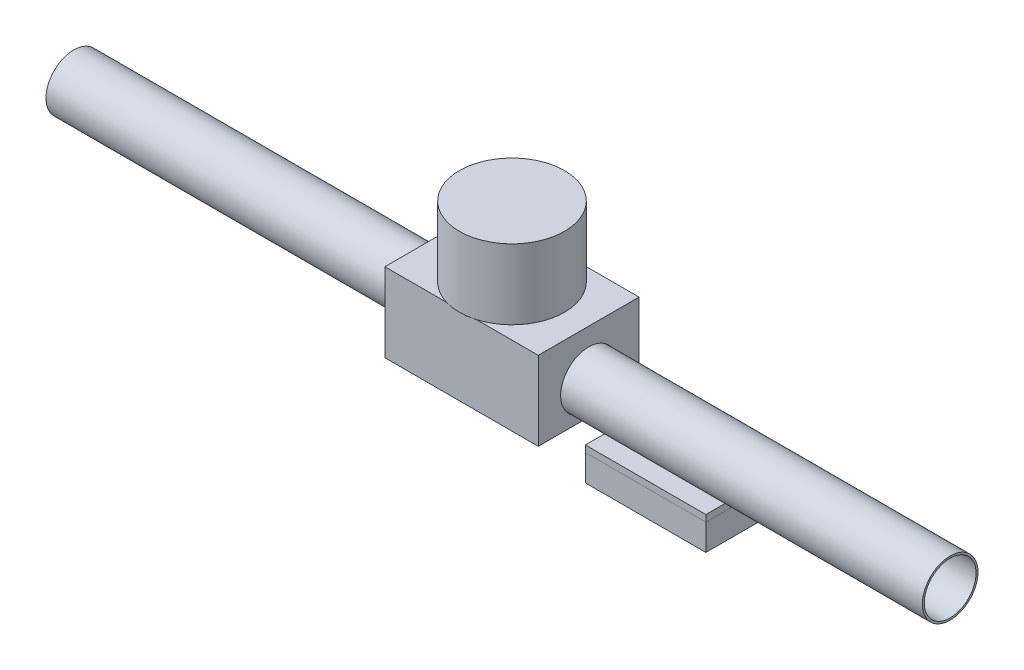
ISO-10303-21;
HEADER;
FILE_DESCRIPTION(('STEP AP214'),'2;1');
FILE_NAME('part.step','',(''),(''),'','','');
FILE_SCHEMA(('AUTOMOTIVE_DESIGN { 1 0 10303 214 1 1 1 1 }'));
ENDSEC;
DATA;
#1=APPLICATION_CONTEXT('core data for automotive mechanical design processes');
#2=APPLICATION_PROTOCOL_DEFINITION('international standard','automotive_design',2000,#1);
#3=PRODUCT_CONTEXT('',#1,'mechanical');
#4=PRODUCT('Part','Part','',(#3));
#5=PRODUCT_RELATED_PRODUCT_CATEGORY('part','',(#4));
#6=PRODUCT_DEFINITION_FORMATION('','',#4);
#7=PRODUCT_DEFINITION_CONTEXT('part definition',#1,'design');
#8=PRODUCT_DEFINITION('design','',#6,#7);
#9=PRODUCT_DEFINITION_SHAPE('','',#8);
#10=(LENGTH_UNIT() NAMED_UNIT(*) SI_UNIT(.MILLI.,.METRE.));
#11=(NAMED_UNIT(*) PLANE_ANGLE_UNIT() SI_UNIT($,.RADIAN.));
#12=(NAMED_UNIT(*) SI_UNIT($,.STERADIAN.) SOLID_ANGLE_UNIT());
#13=UNCERTAINTY_MEASURE_WITH_UNIT(LENGTH_MEASURE(1.E-05),#10,'distance_accuracy_value','');
#14=(GEOMETRIC_REPRESENTATION_CONTEXT(3) GLOBAL_UNCERTAINTY_ASSIGNED_CONTEXT((#13)) GLOBAL_UNIT_ASSIGNED_CONTEXT((#10,
#11,#12)) REPRESENTATION_CONTEXT('',''));
#15=CARTESIAN_POINT('',(0.,0.,0.));
#16=DIRECTION('',(0.,0.,1.));
#17=DIRECTION('',(1.,0.,0.));
#18=AXIS2_PLACEMENT_3D('',#15,#16,#17);
#19=CARTESIAN_POINT('',(47.5,-27.7,14.));
#20=DIRECTION('',(-1.,0.,0.));
#21=DIRECTION('',(0.,0.,1.));
#22=AXIS2_PLACEMENT_3D('',#19,#20,#21);
#23=PLANE('',#22);
#24=DIRECTION('',(0.,0.,1.));
#25=VECTOR('',#24,1.);
#26=CARTESIAN_POINT('',(47.5,-15.7,14.));
#27=LINE('',#26,#25);
#28=CARTESIAN_POINT('',(47.5,-15.7,-14.));
#29=VERTEX_POINT('',#28);
#30=CARTESIAN_POINT('',(47.5,-15.7,14.));
#31=VERTEX_POINT('',#30);
#32=EDGE_CURVE('E120',#29,#31,#27,.T.);
#33=ORIENTED_EDGE('',*,*,#32,.F.);
#34=DIRECTION('',(0.,1.,0.));
#35=VECTOR('',#34,1.);
#36=CARTESIAN_POINT('',(47.5,-27.7,-14.));
#37=LINE('',#36,#35);
#38=CARTESIAN_POINT('',(47.5,-27.7,-14.));
#39=VERTEX_POINT('',#38);
#40=EDGE_CURVE('E12',#39,#29,#37,.T.);
#41=ORIENTED_EDGE('',*,*,#40,.F.);
#42=DIRECTION('',(0.,0.,1.));
#43=VECTOR('',#42,1.);
#44=CARTESIAN_POINT('',(47.5,-27.7,14.));
#45=LINE('',#44,#43);
#46=CARTESIAN_POINT('',(47.5,-27.7,14.));
#47=VERTEX_POINT('',#46);
#48=EDGE_CURVE('E114',#39,#47,#45,.T.);
#49=ORIENTED_EDGE('',*,*,#48,.T.);
#50=DIRECTION('',(0.,1.,0.));
#51=VECTOR('',#50,1.);
#52=CARTESIAN_POINT('',(47.5,-27.7,14.));
#53=LINE('',#52,#51);
#54=EDGE_CURVE('E59',#47,#31,#53,.T.);
#55=ORIENTED_EDGE('',*,*,#54,.T.);
#56=EDGE_LOOP('',(#33,#41,#49,#55));
#57=FACE_BOUND('',#56,.T.);
#58=ADVANCED_FACE('F56',(#57),#23,.T.);
#59=CARTESIAN_POINT('',(47.5,-27.7,-14.));
#60=DIRECTION('',(0.,0.,-1.));
#61=DIRECTION('',(-1.,0.,0.));
#62=AXIS2_PLACEMENT_3D('',#59,#60,#61);
#63=PLANE('',#62);
#64=DIRECTION('',(-1.,0.,0.));
#65=VECTOR('',#64,1.);
#66=CARTESIAN_POINT('',(47.5,-15.7,-14.));
#67=LINE('',#66,#65);
#68=CARTESIAN_POINT('',(102.5,-15.7,-14.));
#69=VERTEX_POINT('',#68);
#70=EDGE_CURVE('E116',#69,#29,#67,.T.);
#71=ORIENTED_EDGE('',*,*,#70,.F.);
#72=DIRECTION('',(0.,1.,0.));
#73=VECTOR('',#72,1.);
#74=CARTESIAN_POINT('',(102.5,-27.7,-14.));
#75=LINE('',#74,#73);
#76=CARTESIAN_POINT('',(102.5,-27.7,-14.));
#77=VERTEX_POINT('',#76);
#78=EDGE_CURVE('E65',#77,#69,#75,.T.);
#79=ORIENTED_EDGE('',*,*,#78,.F.);
#80=DIRECTION('',(-1.,0.,0.));
#81=VECTOR('',#80,1.);
#82=CARTESIAN_POINT('',(47.5,-27.7,-14.));
#83=LINE('',#82,#81);
#84=EDGE_CURVE('E111',#77,#39,#83,.T.);
#85=ORIENTED_EDGE('',*,*,#84,.T.);
#86=ORIENTED_EDGE('',*,*,#40,.T.);
#87=EDGE_LOOP('',(#71,#79,#85,#86));
#88=FACE_BOUND('',#87,.T.);
#89=ADVANCED_FACE('F130',(#88),#63,.T.);
#90=CARTESIAN_POINT('',(102.5,-27.7,14.));
#91=DIRECTION('',(1.,0.,0.));
#92=DIRECTION('',(0.,0.,-1.));
#93=AXIS2_PLACEMENT_3D('',#90,#91,#92);
#94=PLANE('',#93);
#95=DIRECTION('',(0.,0.,-1.));
#96=VECTOR('',#95,1.);
#97=CARTESIAN_POINT('',(102.5,-15.7,14.));
#98=LINE('',#97,#96);
#99=CARTESIAN_POINT('',(102.5,-15.7,14.));
#100=VERTEX_POINT('',#99);
#101=EDGE_CURVE('E106',#100,#69,#98,.T.);
#102=ORIENTED_EDGE('',*,*,#101,.F.);
#103=DIRECTION('',(0.,1.,0.));
#104=VECTOR('',#103,1.);
#105=CARTESIAN_POINT('',(102.5,-27.7,14.));
#106=LINE('',#105,#104);
#107=CARTESIAN_POINT('',(102.5,-27.7,14.));
#108=VERTEX_POINT('',#107);
#109=EDGE_CURVE('E101',#108,#100,#106,.T.);
#110=ORIENTED_EDGE('',*,*,#109,.F.);
#111=DIRECTION('',(0.,0.,-1.));
#112=VECTOR('',#111,1.);
#113=CARTESIAN_POINT('',(102.5,-27.7,14.));
#114=LINE('',#113,#112);
#115=EDGE_CURVE('E104',#108,#77,#114,.T.);
#116=ORIENTED_EDGE('',*,*,#115,.T.);
#117=ORIENTED_EDGE('',*,*,#78,.T.);
#118=EDGE_LOOP('',(#102,#110,#116,#117));
#119=FACE_BOUND('',#118,.T.);
#120=ADVANCED_FACE('F103',(#119),#94,.T.);
#121=CARTESIAN_POINT('',(47.5,-27.7,14.));
#122=DIRECTION('',(0.,0.,1.));
#123=DIRECTION('',(1.,0.,0.));
#124=AXIS2_PLACEMENT_3D('',#121,#122,#123);
#125=PLANE('',#124);
#126=DIRECTION('',(1.,0.,0.));
#127=VECTOR('',#126,1.);
#128=CARTESIAN_POINT('',(47.5,-15.7,14.));
#129=LINE('',#128,#127);
#130=EDGE_CURVE('E123',#31,#100,#129,.T.);
#131=ORIENTED_EDGE('',*,*,#130,.F.);
#132=ORIENTED_EDGE('',*,*,#54,.F.);
#133=DIRECTION('',(1.,0.,0.));
#134=VECTOR('',#133,1.);
#135=CARTESIAN_POINT('',(47.5,-27.7,14.));
#136=LINE('',#135,#134);
#137=EDGE_CURVE('E110',#47,#108,#136,.T.);
#138=ORIENTED_EDGE('',*,*,#137,.T.);
#139=ORIENTED_EDGE('',*,*,#109,.T.);
#140=EDGE_LOOP('',(#131,#132,#138,#139));
#141=FACE_BOUND('',#140,.T.);
#142=ADVANCED_FACE('F113',(#141),#125,.T.);
#143=CARTESIAN_POINT('',(0.,-27.7,0.));
#144=DIRECTION('',(0.,-1.,0.));
#145=DIRECTION('',(0.,0.,-1.));
#146=AXIS2_PLACEMENT_3D('',#143,#144,#145);
#147=PLANE('',#146);
#148=ORIENTED_EDGE('',*,*,#48,.F.);
#149=ORIENTED_EDGE('',*,*,#84,.F.);
#150=ORIENTED_EDGE('',*,*,#115,.F.);
#151=ORIENTED_EDGE('',*,*,#137,.F.);
#152=EDGE_LOOP('',(#148,#149,#150,#151));
#153=FACE_BOUND('',#152,.T.);
#154=ADVANCED_FACE('F109',(#153),#147,.T.);
#155=CARTESIAN_POINT('',(0.,-15.7,0.));
#156=DIRECTION('',(0.,-1.,0.));
#157=DIRECTION('',(0.,0.,-1.));
#158=AXIS2_PLACEMENT_3D('',#155,#156,#157);
#159=PLANE('',#158);
#160=ORIENTED_EDGE('',*,*,#32,.T.);
#161=ORIENTED_EDGE('',*,*,#130,.T.);
#162=ORIENTED_EDGE('',*,*,#101,.T.);
#163=ORIENTED_EDGE('',*,*,#70,.T.);
#164=EDGE_LOOP('',(#160,#161,#162,#163));
#165=FACE_BOUND('',#164,.T.);
#166=ADVANCED_FACE('F129',(#165),#159,.F.);
#167=CLOSED_SHELL('',(#58,#89,#120,#142,#154,#166));
#168=MANIFOLD_SOLID_BREP('B2',#167);
#169=CARTESIAN_POINT('',(47.5,-15.7,14.));
#170=DIRECTION('',(-1.,0.,0.));
#171=DIRECTION('',(0.,0.,1.));
#172=AXIS2_PLACEMENT_3D('',#169,#170,#171);
#173=PLANE('',#172);
#174=DIRECTION('',(0.,0.,1.));
#175=VECTOR('',#174,1.);
#176=CARTESIAN_POINT('',(47.5,-12.7,14.));
#177=LINE('',#176,#175);
#178=CARTESIAN_POINT('',(47.5,-12.7,-14.));
#179=VERTEX_POINT('',#178);
#180=CARTESIAN_POINT('',(47.5,-12.7,14.));
#181=VERTEX_POINT('',#180);
#182=EDGE_CURVE('E258',#179,#181,#177,.T.);
#183=ORIENTED_EDGE('',*,*,#182,.F.);
#184=DIRECTION('',(0.,1.,0.));
#185=VECTOR('',#184,1.);
#186=CARTESIAN_POINT('',(47.5,-15.7,-14.));
#187=LINE('',#186,#185);
#188=CARTESIAN_POINT('',(47.5,-15.7,-14.));
#189=VERTEX_POINT('',#188);
#190=EDGE_CURVE('E54',#189,#179,#187,.T.);
#191=ORIENTED_EDGE('',*,*,#190,.F.);
#192=DIRECTION('',(0.,0.,1.));
#193=VECTOR('',#192,1.);
#194=CARTESIAN_POINT('',(47.5,-15.7,14.));
#195=LINE('',#194,#193);
#196=CARTESIAN_POINT('',(47.5,-15.7,14.));
#197=VERTEX_POINT('',#196);
#198=EDGE_CURVE('E252',#189,#197,#195,.T.);
#199=ORIENTED_EDGE('',*,*,#198,.T.);
#200=DIRECTION('',(0.,1.,0.));
#201=VECTOR('',#200,1.);
#202=CARTESIAN_POINT('',(47.5,-15.7,14.));
#203=LINE('',#202,#201);
#204=EDGE_CURVE('E197',#197,#181,#203,.T.);
#205=ORIENTED_EDGE('',*,*,#204,.T.);
#206=EDGE_LOOP('',(#183,#191,#199,#205));
#207=FACE_BOUND('',#206,.T.);
#208=ADVANCED_FACE('F194',(#207),#173,.T.);
#209=CARTESIAN_POINT('',(47.5,-15.7,-14.));
#210=DIRECTION('',(0.,0.,-1.));
#211=DIRECTION('',(-1.,0.,0.));
#212=AXIS2_PLACEMENT_3D('',#209,#210,#211);
#213=PLANE('',#212);
#214=DIRECTION('',(-1.,0.,0.));
#215=VECTOR('',#214,1.);
#216=CARTESIAN_POINT('',(47.5,-12.7,-14.));
#217=LINE('',#216,#215);
#218=CARTESIAN_POINT('',(102.5,-12.7,-14.));
#219=VERTEX_POINT('',#218);
#220=EDGE_CURVE('E254',#219,#179,#217,.T.);
#221=ORIENTED_EDGE('',*,*,#220,.F.);
#222=DIRECTION('',(0.,1.,0.));
#223=VECTOR('',#222,1.);
#224=CARTESIAN_POINT('',(102.5,-15.7,-14.));
#225=LINE('',#224,#223);
#226=CARTESIAN_POINT('',(102.5,-15.7,-14.));
#227=VERTEX_POINT('',#226);
#228=EDGE_CURVE('E203',#227,#219,#225,.T.);
#229=ORIENTED_EDGE('',*,*,#228,.F.);
#230=DIRECTION('',(-1.,0.,0.));
#231=VECTOR('',#230,1.);
#232=CARTESIAN_POINT('',(47.5,-15.7,-14.));
#233=LINE('',#232,#231);
#234=EDGE_CURVE('E249',#227,#189,#233,.T.);
#235=ORIENTED_EDGE('',*,*,#234,.T.);
#236=ORIENTED_EDGE('',*,*,#190,.T.);
#237=EDGE_LOOP('',(#221,#229,#235,#236));
#238=FACE_BOUND('',#237,.T.);
#239=ADVANCED_FACE('F268',(#238),#213,.T.);
#240=CARTESIAN_POINT('',(102.5,-15.7,14.));
#241=DIRECTION('',(1.,0.,0.));
#242=DIRECTION('',(0.,0.,-1.));
#243=AXIS2_PLACEMENT_3D('',#240,#241,#242);
#244=PLANE('',#243);
#245=DIRECTION('',(0.,0.,-1.));
#246=VECTOR('',#245,1.);
#247=CARTESIAN_POINT('',(102.5,-12.7,14.));
#248=LINE('',#247,#246);
#249=CARTESIAN_POINT('',(102.5,-12.7,14.));
#250=VERTEX_POINT('',#249);
#251=EDGE_CURVE('E244',#250,#219,#248,.T.);
#252=ORIENTED_EDGE('',*,*,#251,.F.);
#253=DIRECTION('',(0.,1.,0.));
#254=VECTOR('',#253,1.);
#255=CARTESIAN_POINT('',(102.5,-15.7,14.));
#256=LINE('',#255,#254);
#257=CARTESIAN_POINT('',(102.5,-15.7,14.));
#258=VERTEX_POINT('',#257);
#259=EDGE_CURVE('E239',#258,#250,#256,.T.);
#260=ORIENTED_EDGE('',*,*,#259,.F.);
#261=DIRECTION('',(0.,0.,-1.));
#262=VECTOR('',#261,1.);
#263=CARTESIAN_POINT('',(102.5,-15.7,14.));
#264=LINE('',#263,#262);
#265=EDGE_CURVE('E242',#258,#227,#264,.T.);
#266=ORIENTED_EDGE('',*,*,#265,.T.);
#267=ORIENTED_EDGE('',*,*,#228,.T.);
#268=EDGE_LOOP('',(#252,#260,#266,#267));
#269=FACE_BOUND('',#268,.T.);
#270=ADVANCED_FACE('F241',(#269),#244,.T.);
#271=CARTESIAN_POINT('',(47.5,-15.7,14.));
#272=DIRECTION('',(0.,0.,1.));
#273=DIRECTION('',(1.,0.,0.));
#274=AXIS2_PLACEMENT_3D('',#271,#272,#273);
#275=PLANE('',#274);
#276=DIRECTION('',(1.,0.,0.));
#277=VECTOR('',#276,1.);
#278=CARTESIAN_POINT('',(47.5,-12.7,14.));
#279=LINE('',#278,#277);
#280=EDGE_CURVE('E261',#181,#250,#279,.T.);
#281=ORIENTED_EDGE('',*,*,#280,.F.);
#282=ORIENTED_EDGE('',*,*,#204,.F.);
#283=DIRECTION('',(1.,0.,0.));
#284=VECTOR('',#283,1.);
#285=CARTESIAN_POINT('',(47.5,-15.7,14.));
#286=LINE('',#285,#284);
#287=EDGE_CURVE('E248',#197,#258,#286,.T.);
#288=ORIENTED_EDGE('',*,*,#287,.T.);
#289=ORIENTED_EDGE('',*,*,#259,.T.);
#290=EDGE_LOOP('',(#281,#282,#288,#289));
#291=FACE_BOUND('',#290,.T.);
#292=ADVANCED_FACE('F251',(#291),#275,.T.);
#293=CARTESIAN_POINT('',(0.,-15.7,0.));
#294=DIRECTION('',(0.,-1.,0.));
#295=DIRECTION('',(0.,0.,-1.));
#296=AXIS2_PLACEMENT_3D('',#293,#294,#295);
#297=PLANE('',#296);
#298=ORIENTED_EDGE('',*,*,#198,.F.);
#299=ORIENTED_EDGE('',*,*,#234,.F.);
#300=ORIENTED_EDGE('',*,*,#265,.F.);
#301=ORIENTED_EDGE('',*,*,#287,.F.);
#302=EDGE_LOOP('',(#298,#299,#300,#301));
#303=FACE_BOUND('',#302,.T.);
#304=ADVANCED_FACE('F247',(#303),#297,.T.);
#305=CARTESIAN_POINT('',(0.,-12.7,0.));
#306=DIRECTION('',(0.,-1.,0.));
#307=DIRECTION('',(0.,0.,-1.));
#308=AXIS2_PLACEMENT_3D('',#305,#306,#307);
#309=PLANE('',#308);
#310=ORIENTED_EDGE('',*,*,#182,.T.);
#311=ORIENTED_EDGE('',*,*,#280,.T.);
#312=ORIENTED_EDGE('',*,*,#251,.T.);
#313=ORIENTED_EDGE('',*,*,#220,.T.);
#314=EDGE_LOOP('',(#310,#311,#312,#313));
#315=FACE_BOUND('',#314,.T.);
#316=ADVANCED_FACE('F267',(#315),#309,.F.);
#317=CLOSED_SHELL('',(#208,#239,#270,#292,#304,#316));
#318=MANIFOLD_SOLID_BREP('B6',#317);
#319=CARTESIAN_POINT('',(0.,53.,0.));
#320=DIRECTION('',(0.,-1.,0.));
#321=DIRECTION('',(0.,0.,-1.));
#322=AXIS2_PLACEMENT_3D('',#319,#320,#321);
#323=CYLINDRICAL_SURFACE('',#322,24.);
#324=CARTESIAN_POINT('',(0.,53.,0.));
#325=DIRECTION('',(0.,1.,0.));
#326=DIRECTION('',(0.,0.,1.));
#327=AXIS2_PLACEMENT_3D('',#324,#325,#326);
#328=CIRCLE('',#327,24.);
#329=CARTESIAN_POINT('',(0.,53.,24.));
#330=VERTEX_POINT('',#329);
#331=EDGE_CURVE('E193',#330,#330,#328,.T.);
#332=ORIENTED_EDGE('',*,*,#331,.F.);
#333=EDGE_LOOP('',(#332));
#334=FACE_BOUND('',#333,.T.);
#335=CARTESIAN_POINT('',(0.,21.,0.));
#336=DIRECTION('',(0.,1.,0.));
#337=DIRECTION('',(0.,0.,1.));
#338=AXIS2_PLACEMENT_3D('',#335,#336,#337);
#339=CIRCLE('',#338,24.);
#340=CARTESIAN_POINT('',(0.,21.,24.));
#341=VERTEX_POINT('',#340);
#342=EDGE_CURVE('E333',#341,#341,#339,.T.);
#343=ORIENTED_EDGE('',*,*,#342,.T.);
#344=EDGE_LOOP('',(#343));
#345=FACE_BOUND('',#344,.T.);
#346=ADVANCED_FACE('F330',(#334,#345),#323,.T.);
#347=CARTESIAN_POINT('',(0.,53.,0.));
#348=DIRECTION('',(0.,1.,0.));
#349=DIRECTION('',(0.,0.,1.));
#350=AXIS2_PLACEMENT_3D('',#347,#348,#349);
#351=PLANE('',#350);
#352=ORIENTED_EDGE('',*,*,#331,.T.);
#353=EDGE_LOOP('',(#352));
#354=FACE_BOUND('',#353,.T.);
#355=ADVANCED_FACE('F345',(#354),#351,.T.);
#356=CARTESIAN_POINT('',(0.,21.,0.));
#357=DIRECTION('',(0.,1.,0.));
#358=DIRECTION('',(0.,0.,1.));
#359=AXIS2_PLACEMENT_3D('',#356,#357,#358);
#360=PLANE('',#359);
#361=ORIENTED_EDGE('',*,*,#342,.F.);
#362=EDGE_LOOP('',(#361));
#363=FACE_BOUND('',#362,.T.);
#364=ADVANCED_FACE('F343',(#363),#360,.F.);
#365=CLOSED_SHELL('',(#346,#355,#364));
#366=MANIFOLD_SOLID_BREP('B48',#365);
#367=CARTESIAN_POINT('',(35.,0.,0.));
#368=DIRECTION('',(-1.,0.,0.));
#369=DIRECTION('',(0.,0.,1.));
#370=AXIS2_PLACEMENT_3D('',#367,#368,#369);
#371=PLANE('',#370);
#372=DIRECTION('',(0.,-1.,0.));
#373=VECTOR('',#372,1.);
#374=CARTESIAN_POINT('',(35.,-15.,23.));
#375=LINE('',#374,#373);
#376=CARTESIAN_POINT('',(35.,21.,23.));
#377=VERTEX_POINT('',#376);
#378=CARTESIAN_POINT('',(35.,-15.,23.));
#379=VERTEX_POINT('',#378);
#380=EDGE_CURVE('E433',#377,#379,#375,.T.);
#381=ORIENTED_EDGE('',*,*,#380,.T.);
#382=DIRECTION('',(0.,0.,-1.));
#383=VECTOR('',#382,1.);
#384=CARTESIAN_POINT('',(35.,-15.,23.));
#385=LINE('',#384,#383);
#386=CARTESIAN_POINT('',(35.,-15.,-23.));
#387=VERTEX_POINT('',#386);
#388=EDGE_CURVE('E428',#379,#387,#385,.T.);
#389=ORIENTED_EDGE('',*,*,#388,.T.);
#390=DIRECTION('',(0.,1.,0.));
#391=VECTOR('',#390,1.);
#392=CARTESIAN_POINT('',(35.,-15.,-23.));
#393=LINE('',#392,#391);
#394=CARTESIAN_POINT('',(35.,21.,-23.));
#395=VERTEX_POINT('',#394);
#396=EDGE_CURVE('E431',#387,#395,#393,.T.);
#397=ORIENTED_EDGE('',*,*,#396,.T.);
#398=DIRECTION('',(0.,0.,1.));
#399=VECTOR('',#398,1.);
#400=CARTESIAN_POINT('',(35.,21.,23.));
#401=LINE('',#400,#399);
#402=EDGE_CURVE('E398',#395,#377,#401,.T.);
#403=ORIENTED_EDGE('',*,*,#402,.T.);
#404=EDGE_LOOP('',(#381,#389,#397,#403));
#405=FACE_BOUND('',#404,.T.);
#406=CARTESIAN_POINT('',(35.,0.,0.));
#407=DIRECTION('',(1.,0.,0.));
#408=DIRECTION('',(0.,0.,-1.));
#409=AXIS2_PLACEMENT_3D('',#406,#407,#408);
#410=CIRCLE('',#409,12.8);
#411=CARTESIAN_POINT('',(35.,0.,-12.8));
#412=VERTEX_POINT('',#411);
#413=EDGE_CURVE('E448',#412,#412,#410,.T.);
#414=ORIENTED_EDGE('',*,*,#413,.F.);
#415=EDGE_LOOP('',(#414));
#416=FACE_BOUND('',#415,.T.);
#417=ADVANCED_FACE('F381',(#405,#416),#371,.F.);
#418=CARTESIAN_POINT('',(-35.,0.,0.));
#419=DIRECTION('',(-1.,0.,0.));
#420=DIRECTION('',(0.,0.,1.));
#421=AXIS2_PLACEMENT_3D('',#418,#419,#420);
#422=PLANE('',#421);
#423=DIRECTION('',(0.,-1.,0.));
#424=VECTOR('',#423,1.);
#425=CARTESIAN_POINT('',(-35.,-15.,23.));
#426=LINE('',#425,#424);
#427=CARTESIAN_POINT('',(-35.,21.,23.));
#428=VERTEX_POINT('',#427);
#429=CARTESIAN_POINT('',(-35.,-15.,23.));
#430=VERTEX_POINT('',#429);
#431=EDGE_CURVE('E445',#428,#430,#426,.T.);
#432=ORIENTED_EDGE('',*,*,#431,.F.);
#433=DIRECTION('',(0.,0.,1.));
#434=VECTOR('',#433,1.);
#435=CARTESIAN_POINT('',(-35.,21.,23.));
#436=LINE('',#435,#434);
#437=CARTESIAN_POINT('',(-35.,21.,-23.));
#438=VERTEX_POINT('',#437);
#439=EDGE_CURVE('E421',#438,#428,#436,.T.);
#440=ORIENTED_EDGE('',*,*,#439,.F.);
#441=DIRECTION('',(0.,1.,0.));
#442=VECTOR('',#441,1.);
#443=CARTESIAN_POINT('',(-35.,-15.,-23.));
#444=LINE('',#443,#442);
#445=CARTESIAN_POINT('',(-35.,-15.,-23.));
#446=VERTEX_POINT('',#445);
#447=EDGE_CURVE('E415',#446,#438,#444,.T.);
#448=ORIENTED_EDGE('',*,*,#447,.F.);
#449=DIRECTION('',(0.,0.,-1.));
#450=VECTOR('',#449,1.);
#451=CARTESIAN_POINT('',(-35.,-15.,23.));
#452=LINE('',#451,#450);
#453=EDGE_CURVE('E437',#430,#446,#452,.T.);
#454=ORIENTED_EDGE('',*,*,#453,.F.);
#455=EDGE_LOOP('',(#432,#440,#448,#454));
#456=FACE_BOUND('',#455,.T.);
#457=CARTESIAN_POINT('',(-35.,0.,0.));
#458=DIRECTION('',(1.,0.,0.));
#459=DIRECTION('',(0.,0.,-1.));
#460=AXIS2_PLACEMENT_3D('',#457,#458,#459);
#461=CIRCLE('',#460,12.8);
#462=CARTESIAN_POINT('',(-35.,0.,-12.8));
#463=VERTEX_POINT('',#462);
#464=EDGE_CURVE('E460',#463,#463,#461,.T.);
#465=ORIENTED_EDGE('',*,*,#464,.T.);
#466=EDGE_LOOP('',(#465));
#467=FACE_BOUND('',#466,.T.);
#468=ADVANCED_FACE('F456',(#456,#467),#422,.T.);
#469=CARTESIAN_POINT('',(35.,-15.,23.));
#470=DIRECTION('',(0.,0.,-1.));
#471=DIRECTION('',(-1.,0.,0.));
#472=AXIS2_PLACEMENT_3D('',#469,#470,#471);
#473=PLANE('',#472);
#474=ORIENTED_EDGE('',*,*,#431,.T.);
#475=DIRECTION('',(-1.,0.,0.));
#476=VECTOR('',#475,1.);
#477=CARTESIAN_POINT('',(35.,-15.,23.));
#478=LINE('',#477,#476);
#479=EDGE_CURVE('E328',#379,#430,#478,.T.);
#480=ORIENTED_EDGE('',*,*,#479,.F.);
#481=ORIENTED_EDGE('',*,*,#380,.F.);
#482=DIRECTION('',(-1.,0.,0.));
#483=VECTOR('',#482,1.);
#484=CARTESIAN_POINT('',(35.,21.,23.));
#485=LINE('',#484,#483);
#486=EDGE_CURVE('E441',#377,#428,#485,.T.);
#487=ORIENTED_EDGE('',*,*,#486,.T.);
#488=EDGE_LOOP('',(#474,#480,#481,#487));
#489=FACE_BOUND('',#488,.T.);
#490=ADVANCED_FACE('F383',(#489),#473,.F.);
#491=CARTESIAN_POINT('',(35.,-15.,23.));
#492=DIRECTION('',(0.,1.,0.));
#493=DIRECTION('',(0.,0.,1.));
#494=AXIS2_PLACEMENT_3D('',#491,#492,#493);
#495=PLANE('',#494);
#496=ORIENTED_EDGE('',*,*,#453,.T.);
#497=DIRECTION('',(-1.,0.,0.));
#498=VECTOR('',#497,1.);
#499=CARTESIAN_POINT('',(35.,-15.,-23.));
#500=LINE('',#499,#498);
#501=EDGE_CURVE('E390',#387,#446,#500,.T.);
#502=ORIENTED_EDGE('',*,*,#501,.F.);
#503=ORIENTED_EDGE('',*,*,#388,.F.);
#504=ORIENTED_EDGE('',*,*,#479,.T.);
#505=EDGE_LOOP('',(#496,#502,#503,#504));
#506=FACE_BOUND('',#505,.T.);
#507=ADVANCED_FACE('F436',(#506),#495,.F.);
#508=CARTESIAN_POINT('',(35.,-15.,-23.));
#509=DIRECTION('',(0.,0.,1.));
#510=DIRECTION('',(1.,0.,0.));
#511=AXIS2_PLACEMENT_3D('',#508,#509,#510);
#512=PLANE('',#511);
#513=ORIENTED_EDGE('',*,*,#447,.T.);
#514=DIRECTION('',(-1.,0.,0.));
#515=VECTOR('',#514,1.);
#516=CARTESIAN_POINT('',(35.,21.,-23.));
#517=LINE('',#516,#515);
#518=EDGE_CURVE('E438',#395,#438,#517,.T.);
#519=ORIENTED_EDGE('',*,*,#518,.F.);
#520=ORIENTED_EDGE('',*,*,#396,.F.);
#521=ORIENTED_EDGE('',*,*,#501,.T.);
#522=EDGE_LOOP('',(#513,#519,#520,#521));
#523=FACE_BOUND('',#522,.T.);
#524=ADVANCED_FACE('F439',(#523),#512,.F.);
#525=CARTESIAN_POINT('',(35.,21.,23.));
#526=DIRECTION('',(0.,-1.,0.));
#527=DIRECTION('',(0.,0.,-1.));
#528=AXIS2_PLACEMENT_3D('',#525,#526,#527);
#529=PLANE('',#528);
#530=ORIENTED_EDGE('',*,*,#439,.T.);
#531=ORIENTED_EDGE('',*,*,#486,.F.);
#532=ORIENTED_EDGE('',*,*,#402,.F.);
#533=ORIENTED_EDGE('',*,*,#518,.T.);
#534=EDGE_LOOP('',(#530,#531,#532,#533));
#535=FACE_BOUND('',#534,.T.);
#536=ADVANCED_FACE('F453',(#535),#529,.F.);
#537=CARTESIAN_POINT('',(35.,0.,0.));
#538=DIRECTION('',(-1.,0.,0.));
#539=DIRECTION('',(0.,0.,1.));
#540=AXIS2_PLACEMENT_3D('',#537,#538,#539);
#541=CYLINDRICAL_SURFACE('',#540,12.8);
#542=ORIENTED_EDGE('',*,*,#413,.T.);
#543=EDGE_LOOP('',(#542));
#544=FACE_BOUND('',#543,.T.);
#545=ORIENTED_EDGE('',*,*,#464,.F.);
#546=EDGE_LOOP('',(#545));
#547=FACE_BOUND('',#546,.T.);
#548=ADVANCED_FACE('F466',(#544,#547),#541,.F.);
#549=CLOSED_SHELL('',(#417,#468,#490,#507,#524,#536,#548));
#550=MANIFOLD_SOLID_BREP('B188',#549);
#551=CARTESIAN_POINT('',(200.,0.,0.));
#552=DIRECTION('',(1.,0.,0.));
#553=DIRECTION('',(0.,0.,-1.));
#554=AXIS2_PLACEMENT_3D('',#551,#552,#553);
#555=PLANE('',#554);
#556=CARTESIAN_POINT('',(200.,0.,0.));
#557=DIRECTION('',(1.,0.,0.));
#558=DIRECTION('',(0.,0.,-1.));
#559=AXIS2_PLACEMENT_3D('',#556,#557,#558);
#560=CIRCLE('',#559,12.7);
#561=CARTESIAN_POINT('',(200.,0.,-12.7));
#562=VERTEX_POINT('',#561);
#563=EDGE_CURVE('E380',#562,#562,#560,.T.);
#564=ORIENTED_EDGE('',*,*,#563,.T.);
#565=EDGE_LOOP('',(#564));
#566=FACE_BOUND('',#565,.T.);
#567=CARTESIAN_POINT('',(200.,0.,0.));
#568=DIRECTION('',(1.,0.,0.));
#569=DIRECTION('',(0.,0.,-1.));
#570=AXIS2_PLACEMENT_3D('',#567,#568,#569);
#571=CIRCLE('',#570,11.811);
#572=CARTESIAN_POINT('',(200.,0.,-11.811));
#573=VERTEX_POINT('',#572);
#574=EDGE_CURVE('E544',#573,#573,#571,.T.);
#575=ORIENTED_EDGE('',*,*,#574,.F.);
#576=EDGE_LOOP('',(#575));
#577=FACE_BOUND('',#576,.T.);
#578=ADVANCED_FACE('F533',(#566,#577),#555,.T.);
#579=CARTESIAN_POINT('',(-200.,0.,0.));
#580=DIRECTION('',(1.,0.,0.));
#581=DIRECTION('',(0.,0.,-1.));
#582=AXIS2_PLACEMENT_3D('',#579,#580,#581);
#583=PLANE('',#582);
#584=CARTESIAN_POINT('',(-200.,0.,0.));
#585=DIRECTION('',(1.,0.,0.));
#586=DIRECTION('',(0.,0.,-1.));
#587=AXIS2_PLACEMENT_3D('',#584,#585,#586);
#588=CIRCLE('',#587,12.7);
#589=CARTESIAN_POINT('',(-200.,0.,-12.7));
#590=VERTEX_POINT('',#589);
#591=EDGE_CURVE('E537',#590,#590,#588,.T.);
#592=ORIENTED_EDGE('',*,*,#591,.F.);
#593=EDGE_LOOP('',(#592));
#594=FACE_BOUND('',#593,.T.);
#595=CARTESIAN_POINT('',(-200.,0.,0.));
#596=DIRECTION('',(1.,0.,0.));
#597=DIRECTION('',(0.,0.,-1.));
#598=AXIS2_PLACEMENT_3D('',#595,#596,#597);
#599=CIRCLE('',#598,11.811);
#600=CARTESIAN_POINT('',(-200.,0.,-11.811));
#601=VERTEX_POINT('',#600);
#602=EDGE_CURVE('E546',#601,#601,#599,.T.);
#603=ORIENTED_EDGE('',*,*,#602,.T.);
#604=EDGE_LOOP('',(#603));
#605=FACE_BOUND('',#604,.T.);
#606=ADVANCED_FACE('F556',(#594,#605),#583,.F.);
#607=CARTESIAN_POINT('',(200.,0.,0.));
#608=DIRECTION('',(-1.,0.,0.));
#609=DIRECTION('',(0.,0.,1.));
#610=AXIS2_PLACEMENT_3D('',#607,#608,#609);
#611=CYLINDRICAL_SURFACE('',#610,12.7);
#612=ORIENTED_EDGE('',*,*,#563,.F.);
#613=EDGE_LOOP('',(#612));
#614=FACE_BOUND('',#613,.T.);
#615=ORIENTED_EDGE('',*,*,#591,.T.);
#616=EDGE_LOOP('',(#615));
#617=FACE_BOUND('',#616,.T.);
#618=ADVANCED_FACE('F535',(#614,#617),#611,.T.);
#619=CARTESIAN_POINT('',(200.,0.,0.));
#620=DIRECTION('',(-1.,0.,0.));
#621=DIRECTION('',(0.,0.,1.));
#622=AXIS2_PLACEMENT_3D('',#619,#620,#621);
#623=CYLINDRICAL_SURFACE('',#622,11.811);
#624=ORIENTED_EDGE('',*,*,#574,.T.);
#625=EDGE_LOOP('',(#624));
#626=FACE_BOUND('',#625,.T.);
#627=ORIENTED_EDGE('',*,*,#602,.F.);
#628=EDGE_LOOP('',(#627));
#629=FACE_BOUND('',#628,.T.);
#630=ADVANCED_FACE('F552',(#626,#629),#623,.F.);
#631=CLOSED_SHELL('',(#578,#606,#618,#630));
#632=MANIFOLD_SOLID_BREP('B322',#631);
#633=ADVANCED_BREP_SHAPE_REPRESENTATION('',(#18,#168,#318,#366,#550,#632),#14);
#634=SHAPE_DEFINITION_REPRESENTATION(#9,#633);
ENDSEC;
END-ISO-10303-21;
